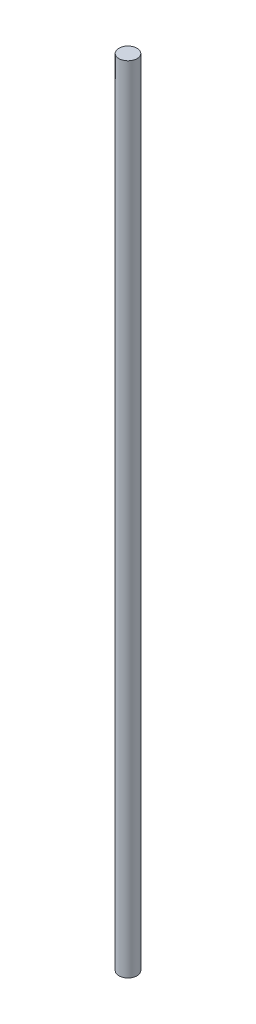
ISO-10303-21;
HEADER;
FILE_DESCRIPTION(('STEP AP214'),'2;1');
FILE_NAME('part.step','',(''),(''),'','','');
FILE_SCHEMA(('AUTOMOTIVE_DESIGN { 1 0 10303 214 1 1 1 1 }'));
ENDSEC;
DATA;
#1=APPLICATION_CONTEXT('core data for automotive mechanical design processes');
#2=APPLICATION_PROTOCOL_DEFINITION('international standard','automotive_design',2000,#1);
#3=PRODUCT_CONTEXT('',#1,'mechanical');
#4=PRODUCT('Part','Part','',(#3));
#5=PRODUCT_RELATED_PRODUCT_CATEGORY('part','',(#4));
#6=PRODUCT_DEFINITION_FORMATION('','',#4);
#7=PRODUCT_DEFINITION_CONTEXT('part definition',#1,'design');
#8=PRODUCT_DEFINITION('design','',#6,#7);
#9=PRODUCT_DEFINITION_SHAPE('','',#8);
#10=(LENGTH_UNIT() NAMED_UNIT(*) SI_UNIT(.MILLI.,.METRE.));
#11=(NAMED_UNIT(*) PLANE_ANGLE_UNIT() SI_UNIT($,.RADIAN.));
#12=(NAMED_UNIT(*) SI_UNIT($,.STERADIAN.) SOLID_ANGLE_UNIT());
#13=UNCERTAINTY_MEASURE_WITH_UNIT(LENGTH_MEASURE(1.E-05),#10,'distance_accuracy_value','');
#14=(GEOMETRIC_REPRESENTATION_CONTEXT(3) GLOBAL_UNCERTAINTY_ASSIGNED_CONTEXT((#13)) GLOBAL_UNIT_ASSIGNED_CONTEXT((#10,
#11,#12)) REPRESENTATION_CONTEXT('',''));
#15=CARTESIAN_POINT('',(0.,0.,0.));
#16=DIRECTION('',(0.,0.,1.));
#17=DIRECTION('',(1.,0.,0.));
#18=AXIS2_PLACEMENT_3D('',#15,#16,#17);
#19=CARTESIAN_POINT('',(0.,351.,0.));
#20=DIRECTION('',(0.,-1.,0.));
#21=DIRECTION('',(0.,0.,-1.));
#22=AXIS2_PLACEMENT_3D('',#19,#20,#21);
#23=CYLINDRICAL_SURFACE('',#22,4.);
#24=CARTESIAN_POINT('',(0.,351.,0.));
#25=DIRECTION('',(0.,1.,0.));
#26=DIRECTION('',(0.,0.,1.));
#27=AXIS2_PLACEMENT_3D('',#24,#25,#26);
#28=CIRCLE('',#27,4.);
#29=CARTESIAN_POINT('',(0.,351.,4.));
#30=VERTEX_POINT('',#29);
#31=EDGE_CURVE('E10',#30,#30,#28,.T.);
#32=ORIENTED_EDGE('',*,*,#31,.F.);
#33=EDGE_LOOP('',(#32));
#34=FACE_BOUND('',#33,.T.);
#35=CARTESIAN_POINT('',(0.,0.,0.));
#36=DIRECTION('',(0.,1.,0.));
#37=DIRECTION('',(0.,0.,1.));
#38=AXIS2_PLACEMENT_3D('',#35,#36,#37);
#39=CIRCLE('',#38,4.);
#40=CARTESIAN_POINT('',(0.,0.,4.));
#41=VERTEX_POINT('',#40);
#42=EDGE_CURVE('E34',#41,#41,#39,.T.);
#43=ORIENTED_EDGE('',*,*,#42,.T.);
#44=EDGE_LOOP('',(#43));
#45=FACE_BOUND('',#44,.T.);
#46=ADVANCED_FACE('F31',(#34,#45),#23,.T.);
#47=CARTESIAN_POINT('',(0.,351.,0.));
#48=DIRECTION('',(0.,1.,0.));
#49=DIRECTION('',(0.,0.,1.));
#50=AXIS2_PLACEMENT_3D('',#47,#48,#49);
#51=PLANE('',#50);
#52=ORIENTED_EDGE('',*,*,#31,.T.);
#53=EDGE_LOOP('',(#52));
#54=FACE_BOUND('',#53,.T.);
#55=ADVANCED_FACE('F46',(#54),#51,.T.);
#56=CARTESIAN_POINT('',(0.,0.,0.));
#57=DIRECTION('',(0.,1.,0.));
#58=DIRECTION('',(0.,0.,1.));
#59=AXIS2_PLACEMENT_3D('',#56,#57,#58);
#60=PLANE('',#59);
#61=ORIENTED_EDGE('',*,*,#42,.F.);
#62=EDGE_LOOP('',(#61));
#63=FACE_BOUND('',#62,.T.);
#64=ADVANCED_FACE('F44',(#63),#60,.F.);
#65=CLOSED_SHELL('',(#46,#55,#64));
#66=MANIFOLD_SOLID_BREP('B2',#65);
#67=ADVANCED_BREP_SHAPE_REPRESENTATION('',(#18,#66),#14);
#68=SHAPE_DEFINITION_REPRESENTATION(#9,#67);
ENDSEC;
END-ISO-10303-21;
